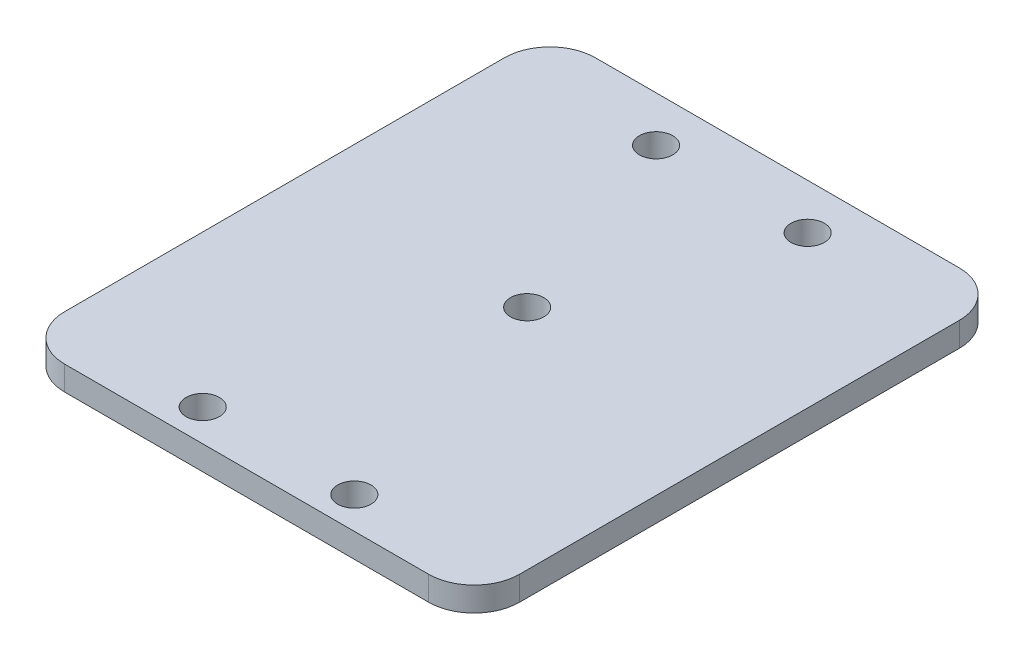
ISO-10303-21;
HEADER;
FILE_DESCRIPTION(('STEP AP214'),'2;1');
FILE_NAME('part.step','',(''),(''),'','','');
FILE_SCHEMA(('AUTOMOTIVE_DESIGN { 1 0 10303 214 1 1 1 1 }'));
ENDSEC;
DATA;
#1=APPLICATION_CONTEXT('core data for automotive mechanical design processes');
#2=APPLICATION_PROTOCOL_DEFINITION('international standard','automotive_design',2000,#1);
#3=PRODUCT_CONTEXT('',#1,'mechanical');
#4=PRODUCT('Part','Part','',(#3));
#5=PRODUCT_RELATED_PRODUCT_CATEGORY('part','',(#4));
#6=PRODUCT_DEFINITION_FORMATION('','',#4);
#7=PRODUCT_DEFINITION_CONTEXT('part definition',#1,'design');
#8=PRODUCT_DEFINITION('design','',#6,#7);
#9=PRODUCT_DEFINITION_SHAPE('','',#8);
#10=(LENGTH_UNIT() NAMED_UNIT(*) SI_UNIT(.MILLI.,.METRE.));
#11=(NAMED_UNIT(*) PLANE_ANGLE_UNIT() SI_UNIT($,.RADIAN.));
#12=(NAMED_UNIT(*) SI_UNIT($,.STERADIAN.) SOLID_ANGLE_UNIT());
#13=UNCERTAINTY_MEASURE_WITH_UNIT(LENGTH_MEASURE(1.E-05),#10,'distance_accuracy_value','');
#14=(GEOMETRIC_REPRESENTATION_CONTEXT(3) GLOBAL_UNCERTAINTY_ASSIGNED_CONTEXT((#13)) GLOBAL_UNIT_ASSIGNED_CONTEXT((#10,
#11,#12)) REPRESENTATION_CONTEXT('',''));
#15=CARTESIAN_POINT('',(0.,0.,0.));
#16=DIRECTION('',(0.,0.,1.));
#17=DIRECTION('',(1.,0.,0.));
#18=AXIS2_PLACEMENT_3D('',#15,#16,#17);
#19=CARTESIAN_POINT('',(0.,0.,0.));
#20=DIRECTION('',(0.,1.,0.));
#21=DIRECTION('',(0.,0.,1.));
#22=AXIS2_PLACEMENT_3D('',#19,#20,#21);
#23=PLANE('',#22);
#24=DIRECTION('',(0.,0.,-1.));
#25=VECTOR('',#24,1.);
#26=CARTESIAN_POINT('',(15.,0.,-17.5));
#27=LINE('',#26,#25);
#28=CARTESIAN_POINT('',(15.,0.,14.5));
#29=VERTEX_POINT('',#28);
#30=CARTESIAN_POINT('',(15.,0.,-14.5));
#31=VERTEX_POINT('',#30);
#32=EDGE_CURVE('E351',#29,#31,#27,.T.);
#33=ORIENTED_EDGE('',*,*,#32,.F.);
#34=CARTESIAN_POINT('',(12.,0.,14.5));
#35=DIRECTION('',(0.,1.,0.));
#36=DIRECTION('',(0.,0.,1.));
#37=AXIS2_PLACEMENT_3D('',#34,#35,#36);
#38=CIRCLE('',#37,3.);
#39=CARTESIAN_POINT('',(12.,0.,17.5));
#40=VERTEX_POINT('',#39);
#41=EDGE_CURVE('E382',#29,#40,#38,.F.);
#42=ORIENTED_EDGE('',*,*,#41,.T.);
#43=DIRECTION('',(1.,0.,0.));
#44=VECTOR('',#43,1.);
#45=CARTESIAN_POINT('',(-15.,0.,17.5));
#46=LINE('',#45,#44);
#47=CARTESIAN_POINT('',(7.00000000000002,0.,17.5));
#48=VERTEX_POINT('',#47);
#49=EDGE_CURVE('E348',#48,#40,#46,.T.);
#50=ORIENTED_EDGE('',*,*,#49,.F.);
#51=DIRECTION('',(0.,0.,1.));
#52=VECTOR('',#51,1.);
#53=CARTESIAN_POINT('',(7.00000000000001,0.,-17.5));
#54=LINE('',#53,#52);
#55=CARTESIAN_POINT('',(7.00000000000001,0.,-17.5));
#56=VERTEX_POINT('',#55);
#57=EDGE_CURVE('E225',#56,#48,#54,.T.);
#58=ORIENTED_EDGE('',*,*,#57,.F.);
#59=DIRECTION('',(-1.,0.,0.));
#60=VECTOR('',#59,1.);
#61=CARTESIAN_POINT('',(-15.,0.,-17.5));
#62=LINE('',#61,#60);
#63=CARTESIAN_POINT('',(12.,0.,-17.5));
#64=VERTEX_POINT('',#63);
#65=EDGE_CURVE('E337',#64,#56,#62,.T.);
#66=ORIENTED_EDGE('',*,*,#65,.F.);
#67=CARTESIAN_POINT('',(12.,0.,-14.5));
#68=DIRECTION('',(0.,1.,0.));
#69=DIRECTION('',(0.,0.,1.));
#70=AXIS2_PLACEMENT_3D('',#67,#68,#69);
#71=CIRCLE('',#70,3.);
#72=EDGE_CURVE('E380',#64,#31,#71,.F.);
#73=ORIENTED_EDGE('',*,*,#72,.T.);
#74=EDGE_LOOP('',(#33,#42,#50,#58,#66,#73));
#75=FACE_BOUND('',#74,.T.);
#76=ADVANCED_FACE('F38',(#75),#23,.F.);
#77=CARTESIAN_POINT('',(3.00000000000001,0.,-17.5));
#78=VERTEX_POINT('',#77);
#79=CARTESIAN_POINT('',(-2.99999999999999,0.,-17.5));
#80=VERTEX_POINT('',#79);
#81=EDGE_CURVE('E357',#78,#80,#62,.T.);
#82=ORIENTED_EDGE('',*,*,#81,.F.);
#83=DIRECTION('',(0.,0.,-1.));
#84=VECTOR('',#83,1.);
#85=CARTESIAN_POINT('',(3.00000000000001,0.,-7.00000000000004));
#86=LINE('',#85,#84);
#87=CARTESIAN_POINT('',(3.00000000000001,0.,-7.00000000000004));
#88=VERTEX_POINT('',#87);
#89=EDGE_CURVE('E227',#88,#78,#86,.T.);
#90=ORIENTED_EDGE('',*,*,#89,.F.);
#91=CARTESIAN_POINT('',(0.500000000000011,0.,-7.00000000000004));
#92=DIRECTION('',(0.,1.,0.));
#93=DIRECTION('',(0.,0.,-1.));
#94=AXIS2_PLACEMENT_3D('',#91,#92,#93);
#95=CIRCLE('',#94,2.5);
#96=CARTESIAN_POINT('',(0.500000000000013,0.,-4.50000000000004));
#97=VERTEX_POINT('',#96);
#98=EDGE_CURVE('E293',#97,#88,#95,.T.);
#99=ORIENTED_EDGE('',*,*,#98,.F.);
#100=DIRECTION('',(1.,0.,0.));
#101=VECTOR('',#100,1.);
#102=CARTESIAN_POINT('',(-0.499999999999989,0.,-4.50000000000004));
#103=LINE('',#102,#101);
#104=CARTESIAN_POINT('',(-0.499999999999989,0.,-4.50000000000004));
#105=VERTEX_POINT('',#104);
#106=EDGE_CURVE('E290',#105,#97,#103,.T.);
#107=ORIENTED_EDGE('',*,*,#106,.F.);
#108=CARTESIAN_POINT('',(-0.499999999999989,0.,-7.00000000000004));
#109=DIRECTION('',(0.,1.,0.));
#110=DIRECTION('',(0.,0.,-1.));
#111=AXIS2_PLACEMENT_3D('',#108,#109,#110);
#112=CIRCLE('',#111,2.5);
#113=CARTESIAN_POINT('',(-2.99999999999999,0.,-7.00000000000004));
#114=VERTEX_POINT('',#113);
#115=EDGE_CURVE('E287',#114,#105,#112,.T.);
#116=ORIENTED_EDGE('',*,*,#115,.F.);
#117=DIRECTION('',(0.,0.,1.));
#118=VECTOR('',#117,1.);
#119=CARTESIAN_POINT('',(-2.99999999999999,0.,-17.5));
#120=LINE('',#119,#118);
#121=EDGE_CURVE('E284',#80,#114,#120,.T.);
#122=ORIENTED_EDGE('',*,*,#121,.F.);
#123=EDGE_LOOP('',(#82,#90,#99,#107,#116,#122));
#124=FACE_BOUND('',#123,.T.);
#125=ADVANCED_FACE('F450',(#124),#23,.F.);
#126=CARTESIAN_POINT('',(-12.,0.,17.5));
#127=VERTEX_POINT('',#126);
#128=CARTESIAN_POINT('',(-6.99999999999998,0.,17.5));
#129=VERTEX_POINT('',#128);
#130=EDGE_CURVE('E349',#127,#129,#46,.T.);
#131=ORIENTED_EDGE('',*,*,#130,.F.);
#132=CARTESIAN_POINT('',(-12.,0.,14.5));
#133=DIRECTION('',(0.,1.,0.));
#134=DIRECTION('',(0.,0.,1.));
#135=AXIS2_PLACEMENT_3D('',#132,#133,#134);
#136=CIRCLE('',#135,3.);
#137=CARTESIAN_POINT('',(-15.,0.,14.5));
#138=VERTEX_POINT('',#137);
#139=EDGE_CURVE('E53',#127,#138,#136,.F.);
#140=ORIENTED_EDGE('',*,*,#139,.T.);
#141=DIRECTION('',(0.,0.,1.));
#142=VECTOR('',#141,1.);
#143=CARTESIAN_POINT('',(-15.,0.,-17.5));
#144=LINE('',#143,#142);
#145=CARTESIAN_POINT('',(-15.,0.,-14.5));
#146=VERTEX_POINT('',#145);
#147=EDGE_CURVE('E299',#146,#138,#144,.T.);
#148=ORIENTED_EDGE('',*,*,#147,.F.);
#149=CARTESIAN_POINT('',(-12.,0.,-14.5));
#150=DIRECTION('',(0.,1.,0.));
#151=DIRECTION('',(0.,0.,1.));
#152=AXIS2_PLACEMENT_3D('',#149,#150,#151);
#153=CIRCLE('',#152,3.);
#154=CARTESIAN_POINT('',(-12.,0.,-17.5));
#155=VERTEX_POINT('',#154);
#156=EDGE_CURVE('E61',#146,#155,#153,.F.);
#157=ORIENTED_EDGE('',*,*,#156,.T.);
#158=CARTESIAN_POINT('',(-6.99999999999999,0.,-17.5));
#159=VERTEX_POINT('',#158);
#160=EDGE_CURVE('E355',#159,#155,#62,.T.);
#161=ORIENTED_EDGE('',*,*,#160,.F.);
#162=DIRECTION('',(0.,0.,-1.));
#163=VECTOR('',#162,1.);
#164=CARTESIAN_POINT('',(-6.99999999999998,0.,17.5));
#165=LINE('',#164,#163);
#166=EDGE_CURVE('E282',#129,#159,#165,.T.);
#167=ORIENTED_EDGE('',*,*,#166,.F.);
#168=EDGE_LOOP('',(#131,#140,#148,#157,#161,#167));
#169=FACE_BOUND('',#168,.T.);
#170=ADVANCED_FACE('F480',(#169),#23,.F.);
#171=CARTESIAN_POINT('',(0.500000000000016,0.,4.99999999999996));
#172=DIRECTION('',(0.,1.,0.));
#173=DIRECTION('',(0.,0.,-1.));
#174=AXIS2_PLACEMENT_3D('',#171,#172,#173);
#175=CIRCLE('',#174,2.5);
#176=CARTESIAN_POINT('',(3.00000000000002,0.,4.99999999999996));
#177=VERTEX_POINT('',#176);
#178=CARTESIAN_POINT('',(0.500000000000015,0.,2.49999999999996));
#179=VERTEX_POINT('',#178);
#180=EDGE_CURVE('E271',#177,#179,#175,.T.);
#181=ORIENTED_EDGE('',*,*,#180,.F.);
#182=DIRECTION('',(0.,0.,-1.));
#183=VECTOR('',#182,1.);
#184=CARTESIAN_POINT('',(3.00000000000002,0.,17.5));
#185=LINE('',#184,#183);
#186=CARTESIAN_POINT('',(3.00000000000002,0.,17.5));
#187=VERTEX_POINT('',#186);
#188=EDGE_CURVE('E206',#187,#177,#185,.T.);
#189=ORIENTED_EDGE('',*,*,#188,.F.);
#190=CARTESIAN_POINT('',(-2.99999999999998,0.,17.5));
#191=VERTEX_POINT('',#190);
#192=EDGE_CURVE('E352',#191,#187,#46,.T.);
#193=ORIENTED_EDGE('',*,*,#192,.F.);
#194=DIRECTION('',(0.,0.,1.));
#195=VECTOR('',#194,1.);
#196=CARTESIAN_POINT('',(-2.99999999999998,0.,4.99999999999996));
#197=LINE('',#196,#195);
#198=CARTESIAN_POINT('',(-2.99999999999998,0.,4.99999999999996));
#199=VERTEX_POINT('',#198);
#200=EDGE_CURVE('E280',#199,#191,#197,.T.);
#201=ORIENTED_EDGE('',*,*,#200,.F.);
#202=CARTESIAN_POINT('',(-0.499999999999984,0.,4.99999999999996));
#203=DIRECTION('',(0.,1.,0.));
#204=DIRECTION('',(0.,0.,-1.));
#205=AXIS2_PLACEMENT_3D('',#202,#203,#204);
#206=CIRCLE('',#205,2.5);
#207=CARTESIAN_POINT('',(-0.499999999999984,0.,2.49999999999996));
#208=VERTEX_POINT('',#207);
#209=EDGE_CURVE('E277',#208,#199,#206,.T.);
#210=ORIENTED_EDGE('',*,*,#209,.F.);
#211=DIRECTION('',(-1.,0.,0.));
#212=VECTOR('',#211,1.);
#213=CARTESIAN_POINT('',(0.500000000000015,0.,2.49999999999996));
#214=LINE('',#213,#212);
#215=EDGE_CURVE('E274',#179,#208,#214,.T.);
#216=ORIENTED_EDGE('',*,*,#215,.F.);
#217=EDGE_LOOP('',(#181,#189,#193,#201,#210,#216));
#218=FACE_BOUND('',#217,.T.);
#219=ADVANCED_FACE('F425',(#218),#23,.F.);
#220=CARTESIAN_POINT('',(-15.,1.6,-17.5));
#221=DIRECTION('',(1.,0.,0.));
#222=DIRECTION('',(0.,0.,-1.));
#223=AXIS2_PLACEMENT_3D('',#220,#221,#222);
#224=PLANE('',#223);
#225=ORIENTED_EDGE('',*,*,#147,.T.);
#226=DIRECTION('',(0.,-1.,0.));
#227=VECTOR('',#226,1.);
#228=CARTESIAN_POINT('',(-15.,1.6,14.5));
#229=LINE('',#228,#227);
#230=CARTESIAN_POINT('',(-15.,1.6,14.5));
#231=VERTEX_POINT('',#230);
#232=EDGE_CURVE('E401',#138,#231,#229,.F.);
#233=ORIENTED_EDGE('',*,*,#232,.T.);
#234=DIRECTION('',(0.,0.,1.));
#235=VECTOR('',#234,1.);
#236=CARTESIAN_POINT('',(-15.,1.6,-17.5));
#237=LINE('',#236,#235);
#238=CARTESIAN_POINT('',(-15.,1.6,-14.5));
#239=VERTEX_POINT('',#238);
#240=EDGE_CURVE('E333',#239,#231,#237,.T.);
#241=ORIENTED_EDGE('',*,*,#240,.F.);
#242=DIRECTION('',(0.,-1.,0.));
#243=VECTOR('',#242,1.);
#244=CARTESIAN_POINT('',(-15.,1.6,-14.5));
#245=LINE('',#244,#243);
#246=EDGE_CURVE('E399',#239,#146,#245,.T.);
#247=ORIENTED_EDGE('',*,*,#246,.T.);
#248=EDGE_LOOP('',(#225,#233,#241,#247));
#249=FACE_BOUND('',#248,.T.);
#250=ADVANCED_FACE('F484',(#249),#224,.F.);
#251=CARTESIAN_POINT('',(-15.,1.6,17.5));
#252=DIRECTION('',(0.,0.,-1.));
#253=DIRECTION('',(-1.,0.,0.));
#254=AXIS2_PLACEMENT_3D('',#251,#252,#253);
#255=PLANE('',#254);
#256=ORIENTED_EDGE('',*,*,#49,.T.);
#257=DIRECTION('',(0.,-1.,0.));
#258=VECTOR('',#257,1.);
#259=CARTESIAN_POINT('',(12.,1.6,17.5));
#260=LINE('',#259,#258);
#261=CARTESIAN_POINT('',(12.,1.6,17.5));
#262=VERTEX_POINT('',#261);
#263=EDGE_CURVE('E387',#40,#262,#260,.F.);
#264=ORIENTED_EDGE('',*,*,#263,.T.);
#265=DIRECTION('',(1.,0.,0.));
#266=VECTOR('',#265,1.);
#267=CARTESIAN_POINT('',(-15.,1.6,17.5));
#268=LINE('',#267,#266);
#269=CARTESIAN_POINT('',(-12.,1.6,17.5));
#270=VERTEX_POINT('',#269);
#271=EDGE_CURVE('E336',#270,#262,#268,.T.);
#272=ORIENTED_EDGE('',*,*,#271,.F.);
#273=DIRECTION('',(0.,-1.,0.));
#274=VECTOR('',#273,1.);
#275=CARTESIAN_POINT('',(-12.,1.6,17.5));
#276=LINE('',#275,#274);
#277=EDGE_CURVE('E384',#270,#127,#276,.T.);
#278=ORIENTED_EDGE('',*,*,#277,.T.);
#279=ORIENTED_EDGE('',*,*,#130,.T.);
#280=DIRECTION('',(0.,-1.,0.));
#281=VECTOR('',#280,1.);
#282=CARTESIAN_POINT('',(-6.99999999999998,0.001,17.5));
#283=LINE('',#282,#281);
#284=CARTESIAN_POINT('',(-6.99999999999998,0.001,17.5));
#285=VERTEX_POINT('',#284);
#286=EDGE_CURVE('E322',#285,#129,#283,.T.);
#287=ORIENTED_EDGE('',*,*,#286,.F.);
#288=DIRECTION('',(-1.,0.,0.));
#289=VECTOR('',#288,1.);
#290=CARTESIAN_POINT('',(-2.99999999999998,0.001,17.5));
#291=LINE('',#290,#289);
#292=CARTESIAN_POINT('',(-2.99999999999998,0.001,17.5));
#293=VERTEX_POINT('',#292);
#294=EDGE_CURVE('E240',#293,#285,#291,.T.);
#295=ORIENTED_EDGE('',*,*,#294,.F.);
#296=DIRECTION('',(0.,-1.,0.));
#297=VECTOR('',#296,1.);
#298=CARTESIAN_POINT('',(-2.99999999999998,0.001,17.5));
#299=LINE('',#298,#297);
#300=EDGE_CURVE('E325',#293,#191,#299,.T.);
#301=ORIENTED_EDGE('',*,*,#300,.T.);
#302=ORIENTED_EDGE('',*,*,#192,.T.);
#303=DIRECTION('',(0.,-1.,0.));
#304=VECTOR('',#303,1.);
#305=CARTESIAN_POINT('',(3.00000000000002,0.001,17.5));
#306=LINE('',#305,#304);
#307=CARTESIAN_POINT('',(3.00000000000002,0.001,17.5));
#308=VERTEX_POINT('',#307);
#309=EDGE_CURVE('E297',#308,#187,#306,.T.);
#310=ORIENTED_EDGE('',*,*,#309,.F.);
#311=DIRECTION('',(-1.,0.,0.));
#312=VECTOR('',#311,1.);
#313=CARTESIAN_POINT('',(7.00000000000002,0.001,17.5));
#314=LINE('',#313,#312);
#315=CARTESIAN_POINT('',(7.00000000000002,0.001,17.5));
#316=VERTEX_POINT('',#315);
#317=EDGE_CURVE('E211',#316,#308,#314,.T.);
#318=ORIENTED_EDGE('',*,*,#317,.F.);
#319=DIRECTION('',(0.,-1.,0.));
#320=VECTOR('',#319,1.);
#321=CARTESIAN_POINT('',(7.00000000000002,0.001,17.5));
#322=LINE('',#321,#320);
#323=EDGE_CURVE('E300',#316,#48,#322,.T.);
#324=ORIENTED_EDGE('',*,*,#323,.T.);
#325=EDGE_LOOP('',(#256,#264,#272,#278,#279,#287,#295,#301,#302,#310,#318,#324));
#326=FACE_BOUND('',#325,.T.);
#327=ADVANCED_FACE('F420',(#326),#255,.F.);
#328=CARTESIAN_POINT('',(15.,1.6,-17.5));
#329=DIRECTION('',(-1.,0.,0.));
#330=DIRECTION('',(0.,0.,1.));
#331=AXIS2_PLACEMENT_3D('',#328,#329,#330);
#332=PLANE('',#331);
#333=DIRECTION('',(0.,0.,-1.));
#334=VECTOR('',#333,1.);
#335=CARTESIAN_POINT('',(15.,1.6,-17.5));
#336=LINE('',#335,#334);
#337=CARTESIAN_POINT('',(15.,1.6,14.5));
#338=VERTEX_POINT('',#337);
#339=CARTESIAN_POINT('',(15.,1.6,-14.5));
#340=VERTEX_POINT('',#339);
#341=EDGE_CURVE('E340',#338,#340,#336,.T.);
#342=ORIENTED_EDGE('',*,*,#341,.F.);
#343=DIRECTION('',(0.,-1.,0.));
#344=VECTOR('',#343,1.);
#345=CARTESIAN_POINT('',(15.,1.6,14.5));
#346=LINE('',#345,#344);
#347=EDGE_CURVE('E377',#338,#29,#346,.T.);
#348=ORIENTED_EDGE('',*,*,#347,.T.);
#349=ORIENTED_EDGE('',*,*,#32,.T.);
#350=DIRECTION('',(0.,-1.,0.));
#351=VECTOR('',#350,1.);
#352=CARTESIAN_POINT('',(15.,1.6,-14.5));
#353=LINE('',#352,#351);
#354=EDGE_CURVE('E346',#31,#340,#353,.F.);
#355=ORIENTED_EDGE('',*,*,#354,.T.);
#356=EDGE_LOOP('',(#342,#348,#349,#355));
#357=FACE_BOUND('',#356,.T.);
#358=ADVANCED_FACE('F520',(#357),#332,.F.);
#359=CARTESIAN_POINT('',(-15.,1.6,-17.5));
#360=DIRECTION('',(0.,0.,1.));
#361=DIRECTION('',(1.,0.,0.));
#362=AXIS2_PLACEMENT_3D('',#359,#360,#361);
#363=PLANE('',#362);
#364=ORIENTED_EDGE('',*,*,#160,.T.);
#365=DIRECTION('',(0.,-1.,0.));
#366=VECTOR('',#365,1.);
#367=CARTESIAN_POINT('',(-12.,1.6,-17.5));
#368=LINE('',#367,#366);
#369=CARTESIAN_POINT('',(-12.,1.6,-17.5));
#370=VERTEX_POINT('',#369);
#371=EDGE_CURVE('E11',#155,#370,#368,.F.);
#372=ORIENTED_EDGE('',*,*,#371,.T.);
#373=DIRECTION('',(-1.,0.,0.));
#374=VECTOR('',#373,1.);
#375=CARTESIAN_POINT('',(-15.,1.6,-17.5));
#376=LINE('',#375,#374);
#377=CARTESIAN_POINT('',(12.,1.6,-17.5));
#378=VERTEX_POINT('',#377);
#379=EDGE_CURVE('E343',#378,#370,#376,.T.);
#380=ORIENTED_EDGE('',*,*,#379,.F.);
#381=DIRECTION('',(0.,-1.,0.));
#382=VECTOR('',#381,1.);
#383=CARTESIAN_POINT('',(12.,1.6,-17.5));
#384=LINE('',#383,#382);
#385=EDGE_CURVE('E46',#378,#64,#384,.T.);
#386=ORIENTED_EDGE('',*,*,#385,.T.);
#387=ORIENTED_EDGE('',*,*,#65,.T.);
#388=DIRECTION('',(0.,-1.,0.));
#389=VECTOR('',#388,1.);
#390=CARTESIAN_POINT('',(7.00000000000001,0.001,-17.5));
#391=LINE('',#390,#389);
#392=CARTESIAN_POINT('',(7.00000000000001,0.001,-17.5));
#393=VERTEX_POINT('',#392);
#394=EDGE_CURVE('E303',#393,#56,#391,.T.);
#395=ORIENTED_EDGE('',*,*,#394,.F.);
#396=DIRECTION('',(1.,0.,0.));
#397=VECTOR('',#396,1.);
#398=CARTESIAN_POINT('',(3.00000000000001,0.001,-17.5));
#399=LINE('',#398,#397);
#400=CARTESIAN_POINT('',(3.00000000000001,0.001,-17.5));
#401=VERTEX_POINT('',#400);
#402=EDGE_CURVE('E264',#401,#393,#399,.T.);
#403=ORIENTED_EDGE('',*,*,#402,.F.);
#404=DIRECTION('',(0.,-1.,0.));
#405=VECTOR('',#404,1.);
#406=CARTESIAN_POINT('',(3.00000000000001,0.001,-17.5));
#407=LINE('',#406,#405);
#408=EDGE_CURVE('E306',#401,#78,#407,.T.);
#409=ORIENTED_EDGE('',*,*,#408,.T.);
#410=ORIENTED_EDGE('',*,*,#81,.T.);
#411=DIRECTION('',(0.,-1.,0.));
#412=VECTOR('',#411,1.);
#413=CARTESIAN_POINT('',(-2.99999999999999,0.001,-17.5));
#414=LINE('',#413,#412);
#415=CARTESIAN_POINT('',(-2.99999999999999,0.001,-17.5));
#416=VERTEX_POINT('',#415);
#417=EDGE_CURVE('E317',#416,#80,#414,.T.);
#418=ORIENTED_EDGE('',*,*,#417,.F.);
#419=DIRECTION('',(1.,0.,0.));
#420=VECTOR('',#419,1.);
#421=CARTESIAN_POINT('',(-6.99999999999999,0.001,-17.5));
#422=LINE('',#421,#420);
#423=CARTESIAN_POINT('',(-6.99999999999999,0.001,-17.5));
#424=VERTEX_POINT('',#423);
#425=EDGE_CURVE('E246',#424,#416,#422,.T.);
#426=ORIENTED_EDGE('',*,*,#425,.F.);
#427=DIRECTION('',(0.,-1.,0.));
#428=VECTOR('',#427,1.);
#429=CARTESIAN_POINT('',(-6.99999999999999,0.001,-17.5));
#430=LINE('',#429,#428);
#431=EDGE_CURVE('E319',#424,#159,#430,.T.);
#432=ORIENTED_EDGE('',*,*,#431,.T.);
#433=EDGE_LOOP('',(#364,#372,#380,#386,#387,#395,#403,#409,#410,#418,#426,#432));
#434=FACE_BOUND('',#433,.T.);
#435=ADVANCED_FACE('F408',(#434),#363,.F.);
#436=CARTESIAN_POINT('',(0.,1.6,0.));
#437=DIRECTION('',(0.,1.,0.));
#438=DIRECTION('',(0.,0.,1.));
#439=AXIS2_PLACEMENT_3D('',#436,#437,#438);
#440=PLANE('',#439);
#441=CARTESIAN_POINT('',(-5.,1.6,-14.5));
#442=DIRECTION('',(0.,1.,0.));
#443=DIRECTION('',(0.,0.,1.));
#444=AXIS2_PLACEMENT_3D('',#441,#442,#443);
#445=CIRCLE('',#444,1.09999999999999);
#446=CARTESIAN_POINT('',(-5.,1.6,-13.4));
#447=VERTEX_POINT('',#446);
#448=EDGE_CURVE('E375',#447,#447,#445,.T.);
#449=ORIENTED_EDGE('',*,*,#448,.F.);
#450=EDGE_LOOP('',(#449));
#451=FACE_BOUND('',#450,.T.);
#452=CARTESIAN_POINT('',(-5.,1.6,15.4));
#453=DIRECTION('',(0.,1.,0.));
#454=DIRECTION('',(0.,0.,1.));
#455=AXIS2_PLACEMENT_3D('',#452,#453,#454);
#456=CIRCLE('',#455,1.09999999999999);
#457=CARTESIAN_POINT('',(-5.,1.6,16.5));
#458=VERTEX_POINT('',#457);
#459=EDGE_CURVE('E371',#458,#458,#456,.T.);
#460=ORIENTED_EDGE('',*,*,#459,.F.);
#461=EDGE_LOOP('',(#460));
#462=FACE_BOUND('',#461,.T.);
#463=CARTESIAN_POINT('',(5.00000000000001,1.6,15.4));
#464=DIRECTION('',(0.,1.,0.));
#465=DIRECTION('',(0.,0.,1.));
#466=AXIS2_PLACEMENT_3D('',#463,#464,#465);
#467=CIRCLE('',#466,1.09999999999999);
#468=CARTESIAN_POINT('',(5.00000000000001,1.6,16.5));
#469=VERTEX_POINT('',#468);
#470=EDGE_CURVE('E367',#469,#469,#467,.T.);
#471=ORIENTED_EDGE('',*,*,#470,.F.);
#472=EDGE_LOOP('',(#471));
#473=FACE_BOUND('',#472,.T.);
#474=CARTESIAN_POINT('',(5.,1.6,-14.5));
#475=DIRECTION('',(0.,1.,0.));
#476=DIRECTION('',(0.,0.,1.));
#477=AXIS2_PLACEMENT_3D('',#474,#475,#476);
#478=CIRCLE('',#477,1.09999999999999);
#479=CARTESIAN_POINT('',(5.,1.6,-13.4));
#480=VERTEX_POINT('',#479);
#481=EDGE_CURVE('E363',#480,#480,#478,.T.);
#482=ORIENTED_EDGE('',*,*,#481,.F.);
#483=EDGE_LOOP('',(#482));
#484=FACE_BOUND('',#483,.T.);
#485=CARTESIAN_POINT('',(0.,1.6,-1.00000000000003));
#486=DIRECTION('',(0.,1.,0.));
#487=DIRECTION('',(0.,0.,1.));
#488=AXIS2_PLACEMENT_3D('',#485,#486,#487);
#489=CIRCLE('',#488,1.09999999999999);
#490=CARTESIAN_POINT('',(0.,1.6,0.0999999999999621));
#491=VERTEX_POINT('',#490);
#492=EDGE_CURVE('E230',#491,#491,#489,.T.);
#493=ORIENTED_EDGE('',*,*,#492,.F.);
#494=EDGE_LOOP('',(#493));
#495=FACE_BOUND('',#494,.T.);
#496=ORIENTED_EDGE('',*,*,#271,.T.);
#497=CARTESIAN_POINT('',(12.,1.6,14.5));
#498=DIRECTION('',(0.,1.,0.));
#499=DIRECTION('',(0.,0.,1.));
#500=AXIS2_PLACEMENT_3D('',#497,#498,#499);
#501=CIRCLE('',#500,3.);
#502=EDGE_CURVE('E395',#262,#338,#501,.T.);
#503=ORIENTED_EDGE('',*,*,#502,.T.);
#504=ORIENTED_EDGE('',*,*,#341,.T.);
#505=CARTESIAN_POINT('',(12.,1.6,-14.5));
#506=DIRECTION('',(0.,1.,0.));
#507=DIRECTION('',(0.,0.,1.));
#508=AXIS2_PLACEMENT_3D('',#505,#506,#507);
#509=CIRCLE('',#508,3.);
#510=EDGE_CURVE('E389',#340,#378,#509,.T.);
#511=ORIENTED_EDGE('',*,*,#510,.T.);
#512=ORIENTED_EDGE('',*,*,#379,.T.);
#513=CARTESIAN_POINT('',(-12.,1.6,-14.5));
#514=DIRECTION('',(0.,1.,0.));
#515=DIRECTION('',(0.,0.,1.));
#516=AXIS2_PLACEMENT_3D('',#513,#514,#515);
#517=CIRCLE('',#516,3.);
#518=EDGE_CURVE('E391',#370,#239,#517,.T.);
#519=ORIENTED_EDGE('',*,*,#518,.T.);
#520=ORIENTED_EDGE('',*,*,#240,.T.);
#521=CARTESIAN_POINT('',(-12.,1.6,14.5));
#522=DIRECTION('',(0.,1.,0.));
#523=DIRECTION('',(0.,0.,1.));
#524=AXIS2_PLACEMENT_3D('',#521,#522,#523);
#525=CIRCLE('',#524,3.);
#526=EDGE_CURVE('E393',#231,#270,#525,.T.);
#527=ORIENTED_EDGE('',*,*,#526,.T.);
#528=EDGE_LOOP('',(#496,#503,#504,#511,#512,#519,#520,#527));
#529=FACE_BOUND('',#528,.T.);
#530=ADVANCED_FACE('F514',(#451,#462,#473,#484,#495,#529),#440,.T.);
#531=CARTESIAN_POINT('',(3.00000000000002,0.001,17.5));
#532=DIRECTION('',(-1.,0.,0.));
#533=DIRECTION('',(0.,0.,1.));
#534=AXIS2_PLACEMENT_3D('',#531,#532,#533);
#535=PLANE('',#534);
#536=ORIENTED_EDGE('',*,*,#188,.T.);
#537=DIRECTION('',(0.,-1.,0.));
#538=VECTOR('',#537,1.);
#539=CARTESIAN_POINT('',(3.00000000000002,0.001,4.99999999999996));
#540=LINE('',#539,#538);
#541=CARTESIAN_POINT('',(3.00000000000002,0.001,4.99999999999996));
#542=VERTEX_POINT('',#541);
#543=EDGE_CURVE('E199',#542,#177,#540,.T.);
#544=ORIENTED_EDGE('',*,*,#543,.F.);
#545=DIRECTION('',(0.,0.,-1.));
#546=VECTOR('',#545,1.);
#547=CARTESIAN_POINT('',(3.00000000000002,0.001,17.5));
#548=LINE('',#547,#546);
#549=EDGE_CURVE('E203',#308,#542,#548,.T.);
#550=ORIENTED_EDGE('',*,*,#549,.F.);
#551=ORIENTED_EDGE('',*,*,#309,.T.);
#552=EDGE_LOOP('',(#536,#544,#550,#551));
#553=FACE_BOUND('',#552,.T.);
#554=ADVANCED_FACE('F201',(#553),#535,.F.);
#555=CARTESIAN_POINT('',(7.00000000000001,0.001,-17.5));
#556=DIRECTION('',(1.,0.,0.));
#557=DIRECTION('',(0.,0.,-1.));
#558=AXIS2_PLACEMENT_3D('',#555,#556,#557);
#559=PLANE('',#558);
#560=ORIENTED_EDGE('',*,*,#57,.T.);
#561=ORIENTED_EDGE('',*,*,#323,.F.);
#562=DIRECTION('',(0.,0.,1.));
#563=VECTOR('',#562,1.);
#564=CARTESIAN_POINT('',(7.00000000000001,0.001,-17.5));
#565=LINE('',#564,#563);
#566=EDGE_CURVE('E267',#393,#316,#565,.T.);
#567=ORIENTED_EDGE('',*,*,#566,.F.);
#568=ORIENTED_EDGE('',*,*,#394,.T.);
#569=EDGE_LOOP('',(#560,#561,#567,#568));
#570=FACE_BOUND('',#569,.T.);
#571=ADVANCED_FACE('F418',(#570),#559,.F.);
#572=CARTESIAN_POINT('',(3.00000000000001,0.001,-7.00000000000004));
#573=DIRECTION('',(-1.,0.,0.));
#574=DIRECTION('',(0.,0.,1.));
#575=AXIS2_PLACEMENT_3D('',#572,#573,#574);
#576=PLANE('',#575);
#577=ORIENTED_EDGE('',*,*,#89,.T.);
#578=ORIENTED_EDGE('',*,*,#408,.F.);
#579=DIRECTION('',(0.,0.,-1.));
#580=VECTOR('',#579,1.);
#581=CARTESIAN_POINT('',(3.00000000000001,0.001,-7.00000000000004));
#582=LINE('',#581,#580);
#583=CARTESIAN_POINT('',(3.00000000000001,0.001,-7.00000000000004));
#584=VERTEX_POINT('',#583);
#585=EDGE_CURVE('E261',#584,#401,#582,.T.);
#586=ORIENTED_EDGE('',*,*,#585,.F.);
#587=DIRECTION('',(0.,-1.,0.));
#588=VECTOR('',#587,1.);
#589=CARTESIAN_POINT('',(3.00000000000001,0.001,-7.00000000000004));
#590=LINE('',#589,#588);
#591=EDGE_CURVE('E309',#584,#88,#590,.T.);
#592=ORIENTED_EDGE('',*,*,#591,.T.);
#593=EDGE_LOOP('',(#577,#578,#586,#592));
#594=FACE_BOUND('',#593,.T.);
#595=ADVANCED_FACE('F465',(#594),#576,.F.);
#596=CARTESIAN_POINT('',(0.500000000000011,0.001,-7.00000000000004));
#597=DIRECTION('',(0.,-1.,0.));
#598=DIRECTION('',(0.,0.,-1.));
#599=AXIS2_PLACEMENT_3D('',#596,#597,#598);
#600=CYLINDRICAL_SURFACE('',#599,2.5);
#601=ORIENTED_EDGE('',*,*,#98,.T.);
#602=ORIENTED_EDGE('',*,*,#591,.F.);
#603=CARTESIAN_POINT('',(0.500000000000011,0.001,-7.00000000000004));
#604=DIRECTION('',(0.,1.,0.));
#605=DIRECTION('',(0.,0.,-1.));
#606=AXIS2_PLACEMENT_3D('',#603,#604,#605);
#607=CIRCLE('',#606,2.5);
#608=CARTESIAN_POINT('',(0.500000000000013,0.001,-4.50000000000004));
#609=VERTEX_POINT('',#608);
#610=EDGE_CURVE('E258',#609,#584,#607,.T.);
#611=ORIENTED_EDGE('',*,*,#610,.F.);
#612=DIRECTION('',(0.,-1.,0.));
#613=VECTOR('',#612,1.);
#614=CARTESIAN_POINT('',(0.500000000000013,0.001,-4.50000000000004));
#615=LINE('',#614,#613);
#616=EDGE_CURVE('E311',#609,#97,#615,.T.);
#617=ORIENTED_EDGE('',*,*,#616,.T.);
#618=EDGE_LOOP('',(#601,#602,#611,#617));
#619=FACE_BOUND('',#618,.T.);
#620=ADVANCED_FACE('F462',(#619),#600,.T.);
#621=CARTESIAN_POINT('',(-0.499999999999989,0.001,-4.50000000000004));
#622=DIRECTION('',(0.,0.,-1.));
#623=DIRECTION('',(-1.,0.,0.));
#624=AXIS2_PLACEMENT_3D('',#621,#622,#623);
#625=PLANE('',#624);
#626=ORIENTED_EDGE('',*,*,#106,.T.);
#627=ORIENTED_EDGE('',*,*,#616,.F.);
#628=DIRECTION('',(1.,0.,0.));
#629=VECTOR('',#628,1.);
#630=CARTESIAN_POINT('',(-0.499999999999989,0.001,-4.50000000000004));
#631=LINE('',#630,#629);
#632=CARTESIAN_POINT('',(-0.499999999999989,0.001,-4.50000000000004));
#633=VERTEX_POINT('',#632);
#634=EDGE_CURVE('E255',#633,#609,#631,.T.);
#635=ORIENTED_EDGE('',*,*,#634,.F.);
#636=DIRECTION('',(0.,-1.,0.));
#637=VECTOR('',#636,1.);
#638=CARTESIAN_POINT('',(-0.499999999999989,0.001,-4.50000000000004));
#639=LINE('',#638,#637);
#640=EDGE_CURVE('E313',#633,#105,#639,.T.);
#641=ORIENTED_EDGE('',*,*,#640,.T.);
#642=EDGE_LOOP('',(#626,#627,#635,#641));
#643=FACE_BOUND('',#642,.T.);
#644=ADVANCED_FACE('F460',(#643),#625,.F.);
#645=CARTESIAN_POINT('',(-0.499999999999989,0.001,-7.00000000000004));
#646=DIRECTION('',(0.,-1.,0.));
#647=DIRECTION('',(0.,0.,-1.));
#648=AXIS2_PLACEMENT_3D('',#645,#646,#647);
#649=CYLINDRICAL_SURFACE('',#648,2.5);
#650=ORIENTED_EDGE('',*,*,#115,.T.);
#651=ORIENTED_EDGE('',*,*,#640,.F.);
#652=CARTESIAN_POINT('',(-0.499999999999989,0.001,-7.00000000000004));
#653=DIRECTION('',(0.,1.,0.));
#654=DIRECTION('',(0.,0.,-1.));
#655=AXIS2_PLACEMENT_3D('',#652,#653,#654);
#656=CIRCLE('',#655,2.5);
#657=CARTESIAN_POINT('',(-2.99999999999999,0.001,-7.00000000000004));
#658=VERTEX_POINT('',#657);
#659=EDGE_CURVE('E252',#658,#633,#656,.T.);
#660=ORIENTED_EDGE('',*,*,#659,.F.);
#661=DIRECTION('',(0.,-1.,0.));
#662=VECTOR('',#661,1.);
#663=CARTESIAN_POINT('',(-2.99999999999999,0.001,-7.00000000000004));
#664=LINE('',#663,#662);
#665=EDGE_CURVE('E315',#658,#114,#664,.T.);
#666=ORIENTED_EDGE('',*,*,#665,.T.);
#667=EDGE_LOOP('',(#650,#651,#660,#666));
#668=FACE_BOUND('',#667,.T.);
#669=ADVANCED_FACE('F455',(#668),#649,.T.);
#670=CARTESIAN_POINT('',(-2.99999999999999,0.001,-17.5));
#671=DIRECTION('',(1.,0.,0.));
#672=DIRECTION('',(0.,0.,-1.));
#673=AXIS2_PLACEMENT_3D('',#670,#671,#672);
#674=PLANE('',#673);
#675=ORIENTED_EDGE('',*,*,#121,.T.);
#676=ORIENTED_EDGE('',*,*,#665,.F.);
#677=DIRECTION('',(0.,0.,1.));
#678=VECTOR('',#677,1.);
#679=CARTESIAN_POINT('',(-2.99999999999999,0.001,-17.5));
#680=LINE('',#679,#678);
#681=EDGE_CURVE('E249',#416,#658,#680,.T.);
#682=ORIENTED_EDGE('',*,*,#681,.F.);
#683=ORIENTED_EDGE('',*,*,#417,.T.);
#684=EDGE_LOOP('',(#675,#676,#682,#683));
#685=FACE_BOUND('',#684,.T.);
#686=ADVANCED_FACE('F447',(#685),#674,.F.);
#687=CARTESIAN_POINT('',(-6.99999999999998,0.001,17.5));
#688=DIRECTION('',(-1.,0.,0.));
#689=DIRECTION('',(0.,0.,1.));
#690=AXIS2_PLACEMENT_3D('',#687,#688,#689);
#691=PLANE('',#690);
#692=ORIENTED_EDGE('',*,*,#166,.T.);
#693=ORIENTED_EDGE('',*,*,#431,.F.);
#694=DIRECTION('',(0.,0.,-1.));
#695=VECTOR('',#694,1.);
#696=CARTESIAN_POINT('',(-6.99999999999998,0.001,17.5));
#697=LINE('',#696,#695);
#698=EDGE_CURVE('E243',#285,#424,#697,.T.);
#699=ORIENTED_EDGE('',*,*,#698,.F.);
#700=ORIENTED_EDGE('',*,*,#286,.T.);
#701=EDGE_LOOP('',(#692,#693,#699,#700));
#702=FACE_BOUND('',#701,.T.);
#703=ADVANCED_FACE('F496',(#702),#691,.F.);
#704=CARTESIAN_POINT('',(-2.99999999999998,0.001,4.99999999999996));
#705=DIRECTION('',(1.,0.,0.));
#706=DIRECTION('',(0.,0.,-1.));
#707=AXIS2_PLACEMENT_3D('',#704,#705,#706);
#708=PLANE('',#707);
#709=ORIENTED_EDGE('',*,*,#200,.T.);
#710=ORIENTED_EDGE('',*,*,#300,.F.);
#711=DIRECTION('',(0.,0.,1.));
#712=VECTOR('',#711,1.);
#713=CARTESIAN_POINT('',(-2.99999999999998,0.001,4.99999999999996));
#714=LINE('',#713,#712);
#715=CARTESIAN_POINT('',(-2.99999999999998,0.001,4.99999999999996));
#716=VERTEX_POINT('',#715);
#717=EDGE_CURVE('E237',#716,#293,#714,.T.);
#718=ORIENTED_EDGE('',*,*,#717,.F.);
#719=DIRECTION('',(0.,-1.,0.));
#720=VECTOR('',#719,1.);
#721=CARTESIAN_POINT('',(-2.99999999999998,0.001,4.99999999999996));
#722=LINE('',#721,#720);
#723=EDGE_CURVE('E328',#716,#199,#722,.T.);
#724=ORIENTED_EDGE('',*,*,#723,.T.);
#725=EDGE_LOOP('',(#709,#710,#718,#724));
#726=FACE_BOUND('',#725,.T.);
#727=ADVANCED_FACE('F437',(#726),#708,.F.);
#728=CARTESIAN_POINT('',(-0.499999999999984,0.001,4.99999999999996));
#729=DIRECTION('',(0.,-1.,0.));
#730=DIRECTION('',(0.,0.,-1.));
#731=AXIS2_PLACEMENT_3D('',#728,#729,#730);
#732=CYLINDRICAL_SURFACE('',#731,2.5);
#733=ORIENTED_EDGE('',*,*,#209,.T.);
#734=ORIENTED_EDGE('',*,*,#723,.F.);
#735=CARTESIAN_POINT('',(-0.499999999999984,0.001,4.99999999999996));
#736=DIRECTION('',(0.,1.,0.));
#737=DIRECTION('',(0.,0.,-1.));
#738=AXIS2_PLACEMENT_3D('',#735,#736,#737);
#739=CIRCLE('',#738,2.5);
#740=CARTESIAN_POINT('',(-0.499999999999984,0.001,2.49999999999996));
#741=VERTEX_POINT('',#740);
#742=EDGE_CURVE('E234',#741,#716,#739,.T.);
#743=ORIENTED_EDGE('',*,*,#742,.F.);
#744=DIRECTION('',(0.,-1.,0.));
#745=VECTOR('',#744,1.);
#746=CARTESIAN_POINT('',(-0.499999999999984,0.001,2.49999999999996));
#747=LINE('',#746,#745);
#748=EDGE_CURVE('E330',#741,#208,#747,.T.);
#749=ORIENTED_EDGE('',*,*,#748,.T.);
#750=EDGE_LOOP('',(#733,#734,#743,#749));
#751=FACE_BOUND('',#750,.T.);
#752=ADVANCED_FACE('F435',(#751),#732,.T.);
#753=CARTESIAN_POINT('',(0.500000000000015,0.001,2.49999999999996));
#754=DIRECTION('',(0.,0.,1.));
#755=DIRECTION('',(1.,0.,0.));
#756=AXIS2_PLACEMENT_3D('',#753,#754,#755);
#757=PLANE('',#756);
#758=ORIENTED_EDGE('',*,*,#215,.T.);
#759=ORIENTED_EDGE('',*,*,#748,.F.);
#760=DIRECTION('',(-1.,0.,0.));
#761=VECTOR('',#760,1.);
#762=CARTESIAN_POINT('',(0.500000000000015,0.001,2.49999999999996));
#763=LINE('',#762,#761);
#764=CARTESIAN_POINT('',(0.500000000000015,0.001,2.49999999999996));
#765=VERTEX_POINT('',#764);
#766=EDGE_CURVE('E219',#765,#741,#763,.T.);
#767=ORIENTED_EDGE('',*,*,#766,.F.);
#768=DIRECTION('',(0.,-1.,0.));
#769=VECTOR('',#768,1.);
#770=CARTESIAN_POINT('',(0.500000000000015,0.001,2.49999999999996));
#771=LINE('',#770,#769);
#772=EDGE_CURVE('E210',#765,#179,#771,.T.);
#773=ORIENTED_EDGE('',*,*,#772,.T.);
#774=EDGE_LOOP('',(#758,#759,#767,#773));
#775=FACE_BOUND('',#774,.T.);
#776=ADVANCED_FACE('F430',(#775),#757,.F.);
#777=CARTESIAN_POINT('',(0.500000000000016,0.001,4.99999999999996));
#778=DIRECTION('',(0.,-1.,0.));
#779=DIRECTION('',(0.,0.,-1.));
#780=AXIS2_PLACEMENT_3D('',#777,#778,#779);
#781=CYLINDRICAL_SURFACE('',#780,2.5);
#782=ORIENTED_EDGE('',*,*,#180,.T.);
#783=ORIENTED_EDGE('',*,*,#772,.F.);
#784=CARTESIAN_POINT('',(0.500000000000016,0.001,4.99999999999996));
#785=DIRECTION('',(0.,1.,0.));
#786=DIRECTION('',(0.,0.,-1.));
#787=AXIS2_PLACEMENT_3D('',#784,#785,#786);
#788=CIRCLE('',#787,2.5);
#789=EDGE_CURVE('E214',#542,#765,#788,.T.);
#790=ORIENTED_EDGE('',*,*,#789,.F.);
#791=ORIENTED_EDGE('',*,*,#543,.T.);
#792=EDGE_LOOP('',(#782,#783,#790,#791));
#793=FACE_BOUND('',#792,.T.);
#794=ADVANCED_FACE('F215',(#793),#781,.T.);
#795=CARTESIAN_POINT('',(0.500000000000016,0.001,4.99999999999996));
#796=DIRECTION('',(0.,-1.,0.));
#797=DIRECTION('',(0.,0.,-1.));
#798=AXIS2_PLACEMENT_3D('',#795,#796,#797);
#799=PLANE('',#798);
#800=CARTESIAN_POINT('',(-5.,0.000999999999999916,-14.5));
#801=DIRECTION('',(0.,-1.,0.));
#802=DIRECTION('',(0.,0.,-1.));
#803=AXIS2_PLACEMENT_3D('',#800,#801,#802);
#804=CIRCLE('',#803,1.09999999999999);
#805=CARTESIAN_POINT('',(-5.,0.000999999999999916,-15.6));
#806=VERTEX_POINT('',#805);
#807=EDGE_CURVE('E372',#806,#806,#804,.T.);
#808=ORIENTED_EDGE('',*,*,#807,.F.);
#809=EDGE_LOOP('',(#808));
#810=FACE_BOUND('',#809,.T.);
#811=CARTESIAN_POINT('',(-5.,0.000999999999999916,15.4));
#812=DIRECTION('',(0.,-1.,0.));
#813=DIRECTION('',(0.,0.,-1.));
#814=AXIS2_PLACEMENT_3D('',#811,#812,#813);
#815=CIRCLE('',#814,1.09999999999999);
#816=CARTESIAN_POINT('',(-5.,0.000999999999999916,14.3));
#817=VERTEX_POINT('',#816);
#818=EDGE_CURVE('E368',#817,#817,#815,.T.);
#819=ORIENTED_EDGE('',*,*,#818,.F.);
#820=EDGE_LOOP('',(#819));
#821=FACE_BOUND('',#820,.T.);
#822=CARTESIAN_POINT('',(5.00000000000001,0.000999999999999916,15.4));
#823=DIRECTION('',(0.,-1.,0.));
#824=DIRECTION('',(0.,0.,-1.));
#825=AXIS2_PLACEMENT_3D('',#822,#823,#824);
#826=CIRCLE('',#825,1.09999999999999);
#827=CARTESIAN_POINT('',(5.00000000000001,0.000999999999999916,14.3));
#828=VERTEX_POINT('',#827);
#829=EDGE_CURVE('E364',#828,#828,#826,.T.);
#830=ORIENTED_EDGE('',*,*,#829,.F.);
#831=EDGE_LOOP('',(#830));
#832=FACE_BOUND('',#831,.T.);
#833=CARTESIAN_POINT('',(5.,0.000999999999999916,-14.5));
#834=DIRECTION('',(0.,-1.,0.));
#835=DIRECTION('',(0.,0.,-1.));
#836=AXIS2_PLACEMENT_3D('',#833,#834,#835);
#837=CIRCLE('',#836,1.09999999999999);
#838=CARTESIAN_POINT('',(5.,0.000999999999999916,-15.6));
#839=VERTEX_POINT('',#838);
#840=EDGE_CURVE('E360',#839,#839,#837,.T.);
#841=ORIENTED_EDGE('',*,*,#840,.F.);
#842=EDGE_LOOP('',(#841));
#843=FACE_BOUND('',#842,.T.);
#844=CARTESIAN_POINT('',(0.,0.000999999999999916,-1.00000000000003));
#845=DIRECTION('',(0.,-1.,0.));
#846=DIRECTION('',(0.,0.,-1.));
#847=AXIS2_PLACEMENT_3D('',#844,#845,#846);
#848=CIRCLE('',#847,1.09999999999999);
#849=CARTESIAN_POINT('',(0.,0.000999999999999916,-2.10000000000002));
#850=VERTEX_POINT('',#849);
#851=EDGE_CURVE('E272',#850,#850,#848,.T.);
#852=ORIENTED_EDGE('',*,*,#851,.F.);
#853=EDGE_LOOP('',(#852));
#854=FACE_BOUND('',#853,.T.);
#855=ORIENTED_EDGE('',*,*,#549,.T.);
#856=ORIENTED_EDGE('',*,*,#789,.T.);
#857=ORIENTED_EDGE('',*,*,#766,.T.);
#858=ORIENTED_EDGE('',*,*,#742,.T.);
#859=ORIENTED_EDGE('',*,*,#717,.T.);
#860=ORIENTED_EDGE('',*,*,#294,.T.);
#861=ORIENTED_EDGE('',*,*,#698,.T.);
#862=ORIENTED_EDGE('',*,*,#425,.T.);
#863=ORIENTED_EDGE('',*,*,#681,.T.);
#864=ORIENTED_EDGE('',*,*,#659,.T.);
#865=ORIENTED_EDGE('',*,*,#634,.T.);
#866=ORIENTED_EDGE('',*,*,#610,.T.);
#867=ORIENTED_EDGE('',*,*,#585,.T.);
#868=ORIENTED_EDGE('',*,*,#402,.T.);
#869=ORIENTED_EDGE('',*,*,#566,.T.);
#870=ORIENTED_EDGE('',*,*,#317,.T.);
#871=EDGE_LOOP('',(#855,#856,#857,#858,#859,#860,#861,#862,#863,#864,#865,#866,#867,#868,#869,#870));
#872=FACE_BOUND('',#871,.T.);
#873=ADVANCED_FACE('F221',(#810,#821,#832,#843,#854,#872),#799,.T.);
#874=CARTESIAN_POINT('',(0.,1.6,-1.00000000000003));
#875=DIRECTION('',(0.,1.,0.));
#876=DIRECTION('',(0.,0.,1.));
#877=AXIS2_PLACEMENT_3D('',#874,#875,#876);
#878=CYLINDRICAL_SURFACE('',#877,1.09999999999999);
#879=ORIENTED_EDGE('',*,*,#851,.T.);
#880=EDGE_LOOP('',(#879));
#881=FACE_BOUND('',#880,.T.);
#882=ORIENTED_EDGE('',*,*,#492,.T.);
#883=EDGE_LOOP('',(#882));
#884=FACE_BOUND('',#883,.T.);
#885=ADVANCED_FACE('F628',(#881,#884),#878,.F.);
#886=CARTESIAN_POINT('',(5.,1.6,-14.5));
#887=DIRECTION('',(0.,1.,0.));
#888=DIRECTION('',(0.,0.,1.));
#889=AXIS2_PLACEMENT_3D('',#886,#887,#888);
#890=CYLINDRICAL_SURFACE('',#889,1.09999999999999);
#891=ORIENTED_EDGE('',*,*,#840,.T.);
#892=EDGE_LOOP('',(#891));
#893=FACE_BOUND('',#892,.T.);
#894=ORIENTED_EDGE('',*,*,#481,.T.);
#895=EDGE_LOOP('',(#894));
#896=FACE_BOUND('',#895,.T.);
#897=ADVANCED_FACE('F620',(#893,#896),#890,.F.);
#898=CARTESIAN_POINT('',(5.00000000000001,1.6,15.4));
#899=DIRECTION('',(0.,1.,0.));
#900=DIRECTION('',(0.,0.,1.));
#901=AXIS2_PLACEMENT_3D('',#898,#899,#900);
#902=CYLINDRICAL_SURFACE('',#901,1.09999999999999);
#903=ORIENTED_EDGE('',*,*,#829,.T.);
#904=EDGE_LOOP('',(#903));
#905=FACE_BOUND('',#904,.T.);
#906=ORIENTED_EDGE('',*,*,#470,.T.);
#907=EDGE_LOOP('',(#906));
#908=FACE_BOUND('',#907,.T.);
#909=ADVANCED_FACE('F612',(#905,#908),#902,.F.);
#910=CARTESIAN_POINT('',(-5.,1.6,15.4));
#911=DIRECTION('',(0.,1.,0.));
#912=DIRECTION('',(0.,0.,1.));
#913=AXIS2_PLACEMENT_3D('',#910,#911,#912);
#914=CYLINDRICAL_SURFACE('',#913,1.09999999999999);
#915=ORIENTED_EDGE('',*,*,#818,.T.);
#916=EDGE_LOOP('',(#915));
#917=FACE_BOUND('',#916,.T.);
#918=ORIENTED_EDGE('',*,*,#459,.T.);
#919=EDGE_LOOP('',(#918));
#920=FACE_BOUND('',#919,.T.);
#921=ADVANCED_FACE('F605',(#917,#920),#914,.F.);
#922=CARTESIAN_POINT('',(-5.,1.6,-14.5));
#923=DIRECTION('',(0.,1.,0.));
#924=DIRECTION('',(0.,0.,1.));
#925=AXIS2_PLACEMENT_3D('',#922,#923,#924);
#926=CYLINDRICAL_SURFACE('',#925,1.09999999999999);
#927=ORIENTED_EDGE('',*,*,#807,.T.);
#928=EDGE_LOOP('',(#927));
#929=FACE_BOUND('',#928,.T.);
#930=ORIENTED_EDGE('',*,*,#448,.T.);
#931=EDGE_LOOP('',(#930));
#932=FACE_BOUND('',#931,.T.);
#933=ADVANCED_FACE('F558',(#929,#932),#926,.F.);
#934=CARTESIAN_POINT('',(12.,1.6,14.5));
#935=DIRECTION('',(0.,-1.,0.));
#936=DIRECTION('',(0.,0.,-1.));
#937=AXIS2_PLACEMENT_3D('',#934,#935,#936);
#938=CYLINDRICAL_SURFACE('',#937,3.);
#939=ORIENTED_EDGE('',*,*,#502,.F.);
#940=ORIENTED_EDGE('',*,*,#263,.F.);
#941=ORIENTED_EDGE('',*,*,#41,.F.);
#942=ORIENTED_EDGE('',*,*,#347,.F.);
#943=EDGE_LOOP('',(#939,#940,#941,#942));
#944=FACE_BOUND('',#943,.T.);
#945=ADVANCED_FACE('F541',(#944),#938,.T.);
#946=CARTESIAN_POINT('',(-12.,1.6,14.5));
#947=DIRECTION('',(0.,-1.,0.));
#948=DIRECTION('',(0.,0.,-1.));
#949=AXIS2_PLACEMENT_3D('',#946,#947,#948);
#950=CYLINDRICAL_SURFACE('',#949,3.);
#951=ORIENTED_EDGE('',*,*,#526,.F.);
#952=ORIENTED_EDGE('',*,*,#232,.F.);
#953=ORIENTED_EDGE('',*,*,#139,.F.);
#954=ORIENTED_EDGE('',*,*,#277,.F.);
#955=EDGE_LOOP('',(#951,#952,#953,#954));
#956=FACE_BOUND('',#955,.T.);
#957=ADVANCED_FACE('F549',(#956),#950,.T.);
#958=CARTESIAN_POINT('',(-12.,1.6,-14.5));
#959=DIRECTION('',(0.,-1.,0.));
#960=DIRECTION('',(0.,0.,-1.));
#961=AXIS2_PLACEMENT_3D('',#958,#959,#960);
#962=CYLINDRICAL_SURFACE('',#961,3.);
#963=ORIENTED_EDGE('',*,*,#518,.F.);
#964=ORIENTED_EDGE('',*,*,#371,.F.);
#965=ORIENTED_EDGE('',*,*,#156,.F.);
#966=ORIENTED_EDGE('',*,*,#246,.F.);
#967=EDGE_LOOP('',(#963,#964,#965,#966));
#968=FACE_BOUND('',#967,.T.);
#969=ADVANCED_FACE('F545',(#968),#962,.T.);
#970=CARTESIAN_POINT('',(12.,1.6,-14.5));
#971=DIRECTION('',(0.,-1.,0.));
#972=DIRECTION('',(0.,0.,-1.));
#973=AXIS2_PLACEMENT_3D('',#970,#971,#972);
#974=CYLINDRICAL_SURFACE('',#973,3.);
#975=ORIENTED_EDGE('',*,*,#510,.F.);
#976=ORIENTED_EDGE('',*,*,#354,.F.);
#977=ORIENTED_EDGE('',*,*,#72,.F.);
#978=ORIENTED_EDGE('',*,*,#385,.F.);
#979=EDGE_LOOP('',(#975,#976,#977,#978));
#980=FACE_BOUND('',#979,.T.);
#981=ADVANCED_FACE('F40',(#980),#974,.T.);
#982=CLOSED_SHELL('',(#76,#125,#170,#219,#250,#327,#358,#435,#530,#554,#571,#595,#620,#644,#669,
#686,#703,#727,#752,#776,#794,#873,#885,#897,#909,#921,#933,#945,#957,#969,#981));
#983=MANIFOLD_SOLID_BREP('B2',#982);
#984=ADVANCED_BREP_SHAPE_REPRESENTATION('',(#18,#983),#14);
#985=SHAPE_DEFINITION_REPRESENTATION(#9,#984);
ENDSEC;
END-ISO-10303-21;
